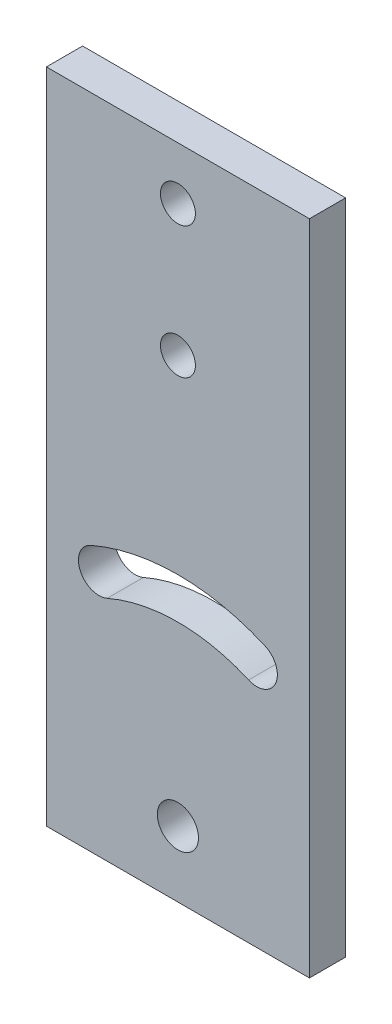
ISO-10303-21;
HEADER;
FILE_DESCRIPTION(('STEP AP214'),'2;1');
FILE_NAME('part.step','',(''),(''),'','','');
FILE_SCHEMA(('AUTOMOTIVE_DESIGN { 1 0 10303 214 1 1 1 1 }'));
ENDSEC;
DATA;
#1=APPLICATION_CONTEXT('core data for automotive mechanical design processes');
#2=APPLICATION_PROTOCOL_DEFINITION('international standard','automotive_design',2000,#1);
#3=PRODUCT_CONTEXT('',#1,'mechanical');
#4=PRODUCT('Part','Part','',(#3));
#5=PRODUCT_RELATED_PRODUCT_CATEGORY('part','',(#4));
#6=PRODUCT_DEFINITION_FORMATION('','',#4);
#7=PRODUCT_DEFINITION_CONTEXT('part definition',#1,'design');
#8=PRODUCT_DEFINITION('design','',#6,#7);
#9=PRODUCT_DEFINITION_SHAPE('','',#8);
#10=(LENGTH_UNIT() NAMED_UNIT(*) SI_UNIT(.MILLI.,.METRE.));
#11=(NAMED_UNIT(*) PLANE_ANGLE_UNIT() SI_UNIT($,.RADIAN.));
#12=(NAMED_UNIT(*) SI_UNIT($,.STERADIAN.) SOLID_ANGLE_UNIT());
#13=UNCERTAINTY_MEASURE_WITH_UNIT(LENGTH_MEASURE(1.E-05),#10,'distance_accuracy_value','');
#14=(GEOMETRIC_REPRESENTATION_CONTEXT(3) GLOBAL_UNCERTAINTY_ASSIGNED_CONTEXT((#13)) GLOBAL_UNIT_ASSIGNED_CONTEXT((#10,
#11,#12)) REPRESENTATION_CONTEXT('',''));
#15=CARTESIAN_POINT('',(0.,0.,0.));
#16=DIRECTION('',(0.,0.,1.));
#17=DIRECTION('',(1.,0.,0.));
#18=AXIS2_PLACEMENT_3D('',#15,#16,#17);
#19=CARTESIAN_POINT('',(0.,0.,6.985));
#20=DIRECTION('',(0.,0.,1.));
#21=DIRECTION('',(1.,0.,0.));
#22=AXIS2_PLACEMENT_3D('',#19,#20,#21);
#23=PLANE('',#22);
#24=CARTESIAN_POINT('',(25.4,116.84,6.985));
#25=DIRECTION('',(0.,0.,1.));
#26=DIRECTION('',(1.,0.,0.));
#27=AXIS2_PLACEMENT_3D('',#24,#25,#26);
#28=CIRCLE('',#27,3.3734375);
#29=CARTESIAN_POINT('',(28.7734375,116.84,6.985));
#30=VERTEX_POINT('',#29);
#31=EDGE_CURVE('E311',#30,#30,#28,.T.);
#32=ORIENTED_EDGE('',*,*,#31,.F.);
#33=EDGE_LOOP('',(#32));
#34=FACE_BOUND('',#33,.T.);
#35=DIRECTION('',(1.,0.,0.));
#36=VECTOR('',#35,1.);
#37=CARTESIAN_POINT('',(0.,127.,6.985));
#38=LINE('',#37,#36);
#39=CARTESIAN_POINT('',(0.,127.,6.985));
#40=VERTEX_POINT('',#39);
#41=CARTESIAN_POINT('',(50.8,127.,6.985));
#42=VERTEX_POINT('',#41);
#43=EDGE_CURVE('E214',#40,#42,#38,.T.);
#44=ORIENTED_EDGE('',*,*,#43,.F.);
#45=DIRECTION('',(0.,1.,0.));
#46=VECTOR('',#45,1.);
#47=CARTESIAN_POINT('',(0.,0.,6.985));
#48=LINE('',#47,#46);
#49=CARTESIAN_POINT('',(0.,0.,6.985));
#50=VERTEX_POINT('',#49);
#51=EDGE_CURVE('E222',#50,#40,#48,.T.);
#52=ORIENTED_EDGE('',*,*,#51,.F.);
#53=DIRECTION('',(1.,0.,0.));
#54=VECTOR('',#53,1.);
#55=CARTESIAN_POINT('',(0.,0.,6.985));
#56=LINE('',#55,#54);
#57=CARTESIAN_POINT('',(50.8,0.,6.985));
#58=VERTEX_POINT('',#57);
#59=EDGE_CURVE('E220',#50,#58,#56,.T.);
#60=ORIENTED_EDGE('',*,*,#59,.T.);
#61=DIRECTION('',(0.,1.,0.));
#62=VECTOR('',#61,1.);
#63=CARTESIAN_POINT('',(50.8,0.,6.985));
#64=LINE('',#63,#62);
#65=EDGE_CURVE('E217',#58,#42,#64,.T.);
#66=ORIENTED_EDGE('',*,*,#65,.T.);
#67=EDGE_LOOP('',(#44,#52,#60,#66));
#68=FACE_BOUND('',#67,.T.);
#69=CARTESIAN_POINT('',(25.4,12.7,6.985));
#70=DIRECTION('',(0.,0.,1.));
#71=DIRECTION('',(1.,0.,0.));
#72=AXIS2_PLACEMENT_3D('',#69,#70,#71);
#73=CIRCLE('',#72,34.13125);
#74=CARTESIAN_POINT('',(39.0525,43.9818073376923,6.985));
#75=VERTEX_POINT('',#74);
#76=CARTESIAN_POINT('',(11.7475,43.9818073376923,6.985));
#77=VERTEX_POINT('',#76);
#78=EDGE_CURVE('E183',#75,#77,#73,.T.);
#79=ORIENTED_EDGE('',*,*,#78,.T.);
#80=CARTESIAN_POINT('',(10.16,47.6192267955635,6.985));
#81=DIRECTION('',(0.,0.,1.));
#82=DIRECTION('',(1.,0.,0.));
#83=AXIS2_PLACEMENT_3D('',#80,#81,#82);
#84=CIRCLE('',#83,3.96875000000001);
#85=CARTESIAN_POINT('',(8.57249999999999,51.2566462534347,6.985));
#86=VERTEX_POINT('',#85);
#87=EDGE_CURVE('E175',#86,#77,#84,.T.);
#88=ORIENTED_EDGE('',*,*,#87,.F.);
#89=CARTESIAN_POINT('',(25.4,12.7,6.985));
#90=DIRECTION('',(0.,0.,1.));
#91=DIRECTION('',(1.,0.,0.));
#92=AXIS2_PLACEMENT_3D('',#89,#90,#91);
#93=CIRCLE('',#92,42.06875);
#94=CARTESIAN_POINT('',(42.2275,51.2566462534347,6.985));
#95=VERTEX_POINT('',#94);
#96=EDGE_CURVE('E182',#95,#86,#93,.T.);
#97=ORIENTED_EDGE('',*,*,#96,.F.);
#98=CARTESIAN_POINT('',(40.64,47.6192267955635,6.985));
#99=DIRECTION('',(0.,0.,1.));
#100=DIRECTION('',(1.,0.,0.));
#101=AXIS2_PLACEMENT_3D('',#98,#99,#100);
#102=CIRCLE('',#101,3.96875);
#103=EDGE_CURVE('E188',#75,#95,#102,.T.);
#104=ORIENTED_EDGE('',*,*,#103,.F.);
#105=EDGE_LOOP('',(#79,#88,#97,#104));
#106=FACE_BOUND('',#105,.T.);
#107=CARTESIAN_POINT('',(25.4,91.44,6.985));
#108=DIRECTION('',(0.,0.,1.));
#109=DIRECTION('',(1.,0.,0.));
#110=AXIS2_PLACEMENT_3D('',#107,#108,#109);
#111=CIRCLE('',#110,3.3734375);
#112=CARTESIAN_POINT('',(28.7734375,91.44,6.985));
#113=VERTEX_POINT('',#112);
#114=EDGE_CURVE('E204',#113,#113,#111,.T.);
#115=ORIENTED_EDGE('',*,*,#114,.F.);
#116=EDGE_LOOP('',(#115));
#117=FACE_BOUND('',#116,.T.);
#118=CARTESIAN_POINT('',(25.4,12.7,6.985));
#119=DIRECTION('',(0.,0.,1.));
#120=DIRECTION('',(1.,0.,0.));
#121=AXIS2_PLACEMENT_3D('',#118,#119,#120);
#122=CIRCLE('',#121,3.96875);
#123=CARTESIAN_POINT('',(29.36875,12.7,6.985));
#124=VERTEX_POINT('',#123);
#125=EDGE_CURVE('E302',#124,#124,#122,.T.);
#126=ORIENTED_EDGE('',*,*,#125,.F.);
#127=EDGE_LOOP('',(#126));
#128=FACE_BOUND('',#127,.T.);
#129=ADVANCED_FACE('F110',(#34,#68,#106,#117,#128),#23,.T.);
#130=CARTESIAN_POINT('',(0.,0.,0.));
#131=DIRECTION('',(0.,0.,1.));
#132=DIRECTION('',(1.,0.,0.));
#133=AXIS2_PLACEMENT_3D('',#130,#131,#132);
#134=PLANE('',#133);
#135=CARTESIAN_POINT('',(10.16,47.6192267955635,0.));
#136=DIRECTION('',(0.,0.,1.));
#137=DIRECTION('',(1.,0.,0.));
#138=AXIS2_PLACEMENT_3D('',#135,#136,#137);
#139=CIRCLE('',#138,3.96875000000001);
#140=CARTESIAN_POINT('',(8.5725,51.2566462534347,0.));
#141=VERTEX_POINT('',#140);
#142=CARTESIAN_POINT('',(11.7475,43.9818073376923,0.));
#143=VERTEX_POINT('',#142);
#144=EDGE_CURVE('E203',#141,#143,#139,.T.);
#145=ORIENTED_EDGE('',*,*,#144,.T.);
#146=CARTESIAN_POINT('',(25.4,12.7,0.));
#147=DIRECTION('',(0.,0.,1.));
#148=DIRECTION('',(1.,0.,0.));
#149=AXIS2_PLACEMENT_3D('',#146,#147,#148);
#150=CIRCLE('',#149,34.13125);
#151=CARTESIAN_POINT('',(39.0525,43.9818073376923,0.));
#152=VERTEX_POINT('',#151);
#153=EDGE_CURVE('E135',#152,#143,#150,.T.);
#154=ORIENTED_EDGE('',*,*,#153,.F.);
#155=CARTESIAN_POINT('',(40.64,47.6192267955635,0.));
#156=DIRECTION('',(0.,0.,1.));
#157=DIRECTION('',(1.,0.,0.));
#158=AXIS2_PLACEMENT_3D('',#155,#156,#157);
#159=CIRCLE('',#158,3.96875);
#160=CARTESIAN_POINT('',(42.2275,51.2566462534347,0.));
#161=VERTEX_POINT('',#160);
#162=EDGE_CURVE('E191',#152,#161,#159,.T.);
#163=ORIENTED_EDGE('',*,*,#162,.T.);
#164=CARTESIAN_POINT('',(25.4,12.7,0.));
#165=DIRECTION('',(0.,0.,1.));
#166=DIRECTION('',(1.,0.,0.));
#167=AXIS2_PLACEMENT_3D('',#164,#165,#166);
#168=CIRCLE('',#167,42.06875);
#169=EDGE_CURVE('E194',#161,#141,#168,.T.);
#170=ORIENTED_EDGE('',*,*,#169,.T.);
#171=EDGE_LOOP('',(#145,#154,#163,#170));
#172=FACE_BOUND('',#171,.T.);
#173=DIRECTION('',(1.,0.,0.));
#174=VECTOR('',#173,1.);
#175=CARTESIAN_POINT('',(0.,127.,0.));
#176=LINE('',#175,#174);
#177=CARTESIAN_POINT('',(0.,127.,0.));
#178=VERTEX_POINT('',#177);
#179=CARTESIAN_POINT('',(50.8,127.,0.));
#180=VERTEX_POINT('',#179);
#181=EDGE_CURVE('E210',#178,#180,#176,.T.);
#182=ORIENTED_EDGE('',*,*,#181,.T.);
#183=DIRECTION('',(0.,1.,0.));
#184=VECTOR('',#183,1.);
#185=CARTESIAN_POINT('',(50.8,0.,0.));
#186=LINE('',#185,#184);
#187=CARTESIAN_POINT('',(50.8,0.,0.));
#188=VERTEX_POINT('',#187);
#189=EDGE_CURVE('E227',#188,#180,#186,.T.);
#190=ORIENTED_EDGE('',*,*,#189,.F.);
#191=DIRECTION('',(1.,0.,0.));
#192=VECTOR('',#191,1.);
#193=CARTESIAN_POINT('',(0.,0.,0.));
#194=LINE('',#193,#192);
#195=CARTESIAN_POINT('',(0.,0.,0.));
#196=VERTEX_POINT('',#195);
#197=EDGE_CURVE('E230',#196,#188,#194,.T.);
#198=ORIENTED_EDGE('',*,*,#197,.F.);
#199=DIRECTION('',(0.,1.,0.));
#200=VECTOR('',#199,1.);
#201=CARTESIAN_POINT('',(0.,0.,0.));
#202=LINE('',#201,#200);
#203=EDGE_CURVE('E218',#196,#178,#202,.T.);
#204=ORIENTED_EDGE('',*,*,#203,.T.);
#205=EDGE_LOOP('',(#182,#190,#198,#204));
#206=FACE_BOUND('',#205,.T.);
#207=CARTESIAN_POINT('',(25.4,91.44,0.));
#208=DIRECTION('',(0.,0.,1.));
#209=DIRECTION('',(1.,0.,0.));
#210=AXIS2_PLACEMENT_3D('',#207,#208,#209);
#211=CIRCLE('',#210,3.3734375);
#212=CARTESIAN_POINT('',(28.7734375,91.44,0.));
#213=VERTEX_POINT('',#212);
#214=EDGE_CURVE('E197',#213,#213,#211,.T.);
#215=ORIENTED_EDGE('',*,*,#214,.T.);
#216=EDGE_LOOP('',(#215));
#217=FACE_BOUND('',#216,.T.);
#218=CARTESIAN_POINT('',(25.4,116.84,0.));
#219=DIRECTION('',(0.,0.,1.));
#220=DIRECTION('',(1.,0.,0.));
#221=AXIS2_PLACEMENT_3D('',#218,#219,#220);
#222=CIRCLE('',#221,3.3734375);
#223=CARTESIAN_POINT('',(28.7734375,116.84,0.));
#224=VERTEX_POINT('',#223);
#225=EDGE_CURVE('E308',#224,#224,#222,.T.);
#226=ORIENTED_EDGE('',*,*,#225,.T.);
#227=EDGE_LOOP('',(#226));
#228=FACE_BOUND('',#227,.T.);
#229=CARTESIAN_POINT('',(25.4,12.7,0.));
#230=DIRECTION('',(0.,0.,1.));
#231=DIRECTION('',(1.,0.,0.));
#232=AXIS2_PLACEMENT_3D('',#229,#230,#231);
#233=CIRCLE('',#232,3.96875);
#234=CARTESIAN_POINT('',(29.36875,12.7,0.));
#235=VERTEX_POINT('',#234);
#236=EDGE_CURVE('E305',#235,#235,#233,.T.);
#237=ORIENTED_EDGE('',*,*,#236,.T.);
#238=EDGE_LOOP('',(#237));
#239=FACE_BOUND('',#238,.T.);
#240=ADVANCED_FACE('F247',(#172,#206,#217,#228,#239),#134,.F.);
#241=CARTESIAN_POINT('',(0.,127.,6.985));
#242=DIRECTION('',(0.,1.,0.));
#243=DIRECTION('',(0.,0.,1.));
#244=AXIS2_PLACEMENT_3D('',#241,#242,#243);
#245=PLANE('',#244);
#246=ORIENTED_EDGE('',*,*,#181,.F.);
#247=DIRECTION('',(0.,0.,-1.));
#248=VECTOR('',#247,1.);
#249=CARTESIAN_POINT('',(0.,127.,6.985));
#250=LINE('',#249,#248);
#251=EDGE_CURVE('E12',#40,#178,#250,.T.);
#252=ORIENTED_EDGE('',*,*,#251,.F.);
#253=ORIENTED_EDGE('',*,*,#43,.T.);
#254=DIRECTION('',(0.,0.,-1.));
#255=VECTOR('',#254,1.);
#256=CARTESIAN_POINT('',(50.8,127.,6.985));
#257=LINE('',#256,#255);
#258=EDGE_CURVE('E114',#42,#180,#257,.T.);
#259=ORIENTED_EDGE('',*,*,#258,.T.);
#260=EDGE_LOOP('',(#246,#252,#253,#259));
#261=FACE_BOUND('',#260,.T.);
#262=ADVANCED_FACE('F112',(#261),#245,.T.);
#263=CARTESIAN_POINT('',(0.,0.,6.985));
#264=DIRECTION('',(-1.,0.,0.));
#265=DIRECTION('',(0.,0.,1.));
#266=AXIS2_PLACEMENT_3D('',#263,#264,#265);
#267=PLANE('',#266);
#268=ORIENTED_EDGE('',*,*,#203,.F.);
#269=DIRECTION('',(0.,0.,-1.));
#270=VECTOR('',#269,1.);
#271=CARTESIAN_POINT('',(0.,0.,6.985));
#272=LINE('',#271,#270);
#273=EDGE_CURVE('E119',#50,#196,#272,.T.);
#274=ORIENTED_EDGE('',*,*,#273,.F.);
#275=ORIENTED_EDGE('',*,*,#51,.T.);
#276=ORIENTED_EDGE('',*,*,#251,.T.);
#277=EDGE_LOOP('',(#268,#274,#275,#276));
#278=FACE_BOUND('',#277,.T.);
#279=ADVANCED_FACE('F251',(#278),#267,.T.);
#280=CARTESIAN_POINT('',(0.,0.,6.985));
#281=DIRECTION('',(0.,1.,0.));
#282=DIRECTION('',(0.,0.,1.));
#283=AXIS2_PLACEMENT_3D('',#280,#281,#282);
#284=PLANE('',#283);
#285=ORIENTED_EDGE('',*,*,#197,.T.);
#286=DIRECTION('',(0.,0.,-1.));
#287=VECTOR('',#286,1.);
#288=CARTESIAN_POINT('',(50.8,0.,6.985));
#289=LINE('',#288,#287);
#290=EDGE_CURVE('E234',#58,#188,#289,.T.);
#291=ORIENTED_EDGE('',*,*,#290,.F.);
#292=ORIENTED_EDGE('',*,*,#59,.F.);
#293=ORIENTED_EDGE('',*,*,#273,.T.);
#294=EDGE_LOOP('',(#285,#291,#292,#293));
#295=FACE_BOUND('',#294,.T.);
#296=ADVANCED_FACE('F256',(#295),#284,.F.);
#297=CARTESIAN_POINT('',(50.8,0.,6.985));
#298=DIRECTION('',(-1.,0.,0.));
#299=DIRECTION('',(0.,0.,1.));
#300=AXIS2_PLACEMENT_3D('',#297,#298,#299);
#301=PLANE('',#300);
#302=ORIENTED_EDGE('',*,*,#189,.T.);
#303=ORIENTED_EDGE('',*,*,#258,.F.);
#304=ORIENTED_EDGE('',*,*,#65,.F.);
#305=ORIENTED_EDGE('',*,*,#290,.T.);
#306=EDGE_LOOP('',(#302,#303,#304,#305));
#307=FACE_BOUND('',#306,.T.);
#308=ADVANCED_FACE('F244',(#307),#301,.F.);
#309=CARTESIAN_POINT('',(25.4,12.7,6.985));
#310=DIRECTION('',(0.,0.,-1.));
#311=DIRECTION('',(-1.,0.,0.));
#312=AXIS2_PLACEMENT_3D('',#309,#310,#311);
#313=CYLINDRICAL_SURFACE('',#312,34.13125);
#314=ORIENTED_EDGE('',*,*,#153,.T.);
#315=DIRECTION('',(0.,0.,-1.));
#316=VECTOR('',#315,1.);
#317=CARTESIAN_POINT('',(11.7475,43.9818073376923,6.985));
#318=LINE('',#317,#316);
#319=EDGE_CURVE('E177',#77,#143,#318,.T.);
#320=ORIENTED_EDGE('',*,*,#319,.F.);
#321=ORIENTED_EDGE('',*,*,#78,.F.);
#322=DIRECTION('',(0.,0.,-1.));
#323=VECTOR('',#322,1.);
#324=CARTESIAN_POINT('',(39.0525,43.9818073376923,6.985));
#325=LINE('',#324,#323);
#326=EDGE_CURVE('E208',#75,#152,#325,.T.);
#327=ORIENTED_EDGE('',*,*,#326,.T.);
#328=EDGE_LOOP('',(#314,#320,#321,#327));
#329=FACE_BOUND('',#328,.T.);
#330=ADVANCED_FACE('F186',(#329),#313,.T.);
#331=CARTESIAN_POINT('',(40.64,47.6192267955635,6.985));
#332=DIRECTION('',(0.,0.,-1.));
#333=DIRECTION('',(-1.,0.,0.));
#334=AXIS2_PLACEMENT_3D('',#331,#332,#333);
#335=CYLINDRICAL_SURFACE('',#334,3.96875);
#336=ORIENTED_EDGE('',*,*,#162,.F.);
#337=ORIENTED_EDGE('',*,*,#326,.F.);
#338=ORIENTED_EDGE('',*,*,#103,.T.);
#339=DIRECTION('',(0.,0.,-1.));
#340=VECTOR('',#339,1.);
#341=CARTESIAN_POINT('',(42.2275,51.2566462534347,6.985));
#342=LINE('',#341,#340);
#343=EDGE_CURVE('E211',#95,#161,#342,.T.);
#344=ORIENTED_EDGE('',*,*,#343,.T.);
#345=EDGE_LOOP('',(#336,#337,#338,#344));
#346=FACE_BOUND('',#345,.T.);
#347=ADVANCED_FACE('F276',(#346),#335,.F.);
#348=CARTESIAN_POINT('',(25.4,12.7,6.985));
#349=DIRECTION('',(0.,0.,-1.));
#350=DIRECTION('',(-1.,0.,0.));
#351=AXIS2_PLACEMENT_3D('',#348,#349,#350);
#352=CYLINDRICAL_SURFACE('',#351,42.06875);
#353=ORIENTED_EDGE('',*,*,#169,.F.);
#354=ORIENTED_EDGE('',*,*,#343,.F.);
#355=ORIENTED_EDGE('',*,*,#96,.T.);
#356=DIRECTION('',(0.,0.,-1.));
#357=VECTOR('',#356,1.);
#358=CARTESIAN_POINT('',(8.5725,51.2566462534347,6.985));
#359=LINE('',#358,#357);
#360=EDGE_CURVE('E127',#86,#141,#359,.T.);
#361=ORIENTED_EDGE('',*,*,#360,.T.);
#362=EDGE_LOOP('',(#353,#354,#355,#361));
#363=FACE_BOUND('',#362,.T.);
#364=ADVANCED_FACE('F280',(#363),#352,.F.);
#365=CARTESIAN_POINT('',(10.16,47.6192267955635,6.985));
#366=DIRECTION('',(0.,0.,-1.));
#367=DIRECTION('',(-1.,0.,0.));
#368=AXIS2_PLACEMENT_3D('',#365,#366,#367);
#369=CYLINDRICAL_SURFACE('',#368,3.96875000000001);
#370=ORIENTED_EDGE('',*,*,#144,.F.);
#371=ORIENTED_EDGE('',*,*,#360,.F.);
#372=ORIENTED_EDGE('',*,*,#87,.T.);
#373=ORIENTED_EDGE('',*,*,#319,.T.);
#374=EDGE_LOOP('',(#370,#371,#372,#373));
#375=FACE_BOUND('',#374,.T.);
#376=ADVANCED_FACE('F176',(#375),#369,.F.);
#377=CARTESIAN_POINT('',(25.4,91.44,6.985));
#378=DIRECTION('',(0.,0.,-1.));
#379=DIRECTION('',(-1.,0.,0.));
#380=AXIS2_PLACEMENT_3D('',#377,#378,#379);
#381=CYLINDRICAL_SURFACE('',#380,3.3734375);
#382=ORIENTED_EDGE('',*,*,#114,.T.);
#383=EDGE_LOOP('',(#382));
#384=FACE_BOUND('',#383,.T.);
#385=ORIENTED_EDGE('',*,*,#214,.F.);
#386=EDGE_LOOP('',(#385));
#387=FACE_BOUND('',#386,.T.);
#388=ADVANCED_FACE('F279',(#384,#387),#381,.F.);
#389=CARTESIAN_POINT('',(25.4,116.84,6.985));
#390=DIRECTION('',(0.,0.,-1.));
#391=DIRECTION('',(-1.,0.,0.));
#392=AXIS2_PLACEMENT_3D('',#389,#390,#391);
#393=CYLINDRICAL_SURFACE('',#392,3.3734375);
#394=ORIENTED_EDGE('',*,*,#31,.T.);
#395=EDGE_LOOP('',(#394));
#396=FACE_BOUND('',#395,.T.);
#397=ORIENTED_EDGE('',*,*,#225,.F.);
#398=EDGE_LOOP('',(#397));
#399=FACE_BOUND('',#398,.T.);
#400=ADVANCED_FACE('F289',(#396,#399),#393,.F.);
#401=CARTESIAN_POINT('',(25.4,12.7,6.985));
#402=DIRECTION('',(0.,0.,-1.));
#403=DIRECTION('',(-1.,0.,0.));
#404=AXIS2_PLACEMENT_3D('',#401,#402,#403);
#405=CYLINDRICAL_SURFACE('',#404,3.96875);
#406=ORIENTED_EDGE('',*,*,#125,.T.);
#407=EDGE_LOOP('',(#406));
#408=FACE_BOUND('',#407,.T.);
#409=ORIENTED_EDGE('',*,*,#236,.F.);
#410=EDGE_LOOP('',(#409));
#411=FACE_BOUND('',#410,.T.);
#412=ADVANCED_FACE('F293',(#408,#411),#405,.F.);
#413=CLOSED_SHELL('',(#129,#240,#262,#279,#296,#308,#330,#347,#364,#376,#388,#400,#412));
#414=MANIFOLD_SOLID_BREP('B2',#413);
#415=ADVANCED_BREP_SHAPE_REPRESENTATION('',(#18,#414),#14);
#416=SHAPE_DEFINITION_REPRESENTATION(#9,#415);
ENDSEC;
END-ISO-10303-21;
